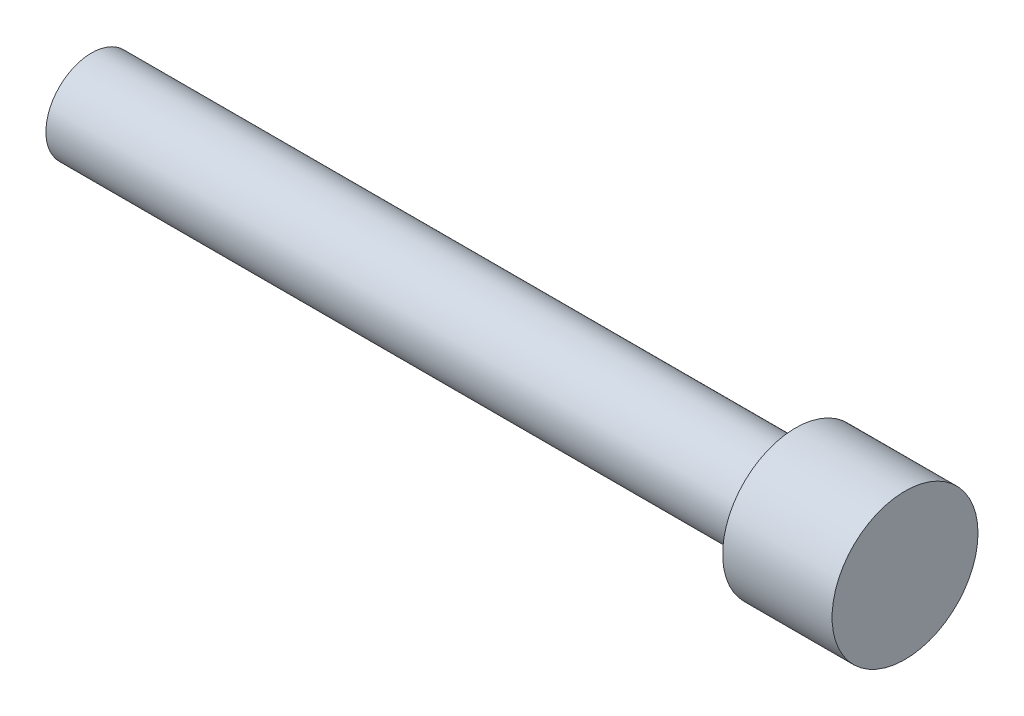
ISO-10303-21;
HEADER;
FILE_DESCRIPTION(('STEP AP214'),'2;1');
FILE_NAME('part.step','',(''),(''),'','','');
FILE_SCHEMA(('AUTOMOTIVE_DESIGN { 1 0 10303 214 1 1 1 1 }'));
ENDSEC;
DATA;
#1=APPLICATION_CONTEXT('core data for automotive mechanical design processes');
#2=APPLICATION_PROTOCOL_DEFINITION('international standard','automotive_design',2000,#1);
#3=PRODUCT_CONTEXT('',#1,'mechanical');
#4=PRODUCT('Part','Part','',(#3));
#5=PRODUCT_RELATED_PRODUCT_CATEGORY('part','',(#4));
#6=PRODUCT_DEFINITION_FORMATION('','',#4);
#7=PRODUCT_DEFINITION_CONTEXT('part definition',#1,'design');
#8=PRODUCT_DEFINITION('design','',#6,#7);
#9=PRODUCT_DEFINITION_SHAPE('','',#8);
#10=(LENGTH_UNIT() NAMED_UNIT(*) SI_UNIT(.MILLI.,.METRE.));
#11=(NAMED_UNIT(*) PLANE_ANGLE_UNIT() SI_UNIT($,.RADIAN.));
#12=(NAMED_UNIT(*) SI_UNIT($,.STERADIAN.) SOLID_ANGLE_UNIT());
#13=UNCERTAINTY_MEASURE_WITH_UNIT(LENGTH_MEASURE(1.E-05),#10,'distance_accuracy_value','');
#14=(GEOMETRIC_REPRESENTATION_CONTEXT(3) GLOBAL_UNCERTAINTY_ASSIGNED_CONTEXT((#13)) GLOBAL_UNIT_ASSIGNED_CONTEXT((#10,
#11,#12)) REPRESENTATION_CONTEXT('',''));
#15=CARTESIAN_POINT('',(0.,0.,0.));
#16=DIRECTION('',(0.,0.,1.));
#17=DIRECTION('',(1.,0.,0.));
#18=AXIS2_PLACEMENT_3D('',#15,#16,#17);
#19=CARTESIAN_POINT('',(9.65,0.,0.));
#20=DIRECTION('',(-1.,0.,0.));
#21=DIRECTION('',(0.,0.,1.));
#22=AXIS2_PLACEMENT_3D('',#19,#20,#21);
#23=CYLINDRICAL_SURFACE('',#22,1.25);
#24=CARTESIAN_POINT('',(9.65,0.,0.));
#25=DIRECTION('',(1.,0.,0.));
#26=DIRECTION('',(0.,0.,-1.));
#27=AXIS2_PLACEMENT_3D('',#24,#25,#26);
#28=CIRCLE('',#27,1.25);
#29=CARTESIAN_POINT('',(9.65,0.,-1.25));
#30=VERTEX_POINT('',#29);
#31=EDGE_CURVE('E10',#30,#30,#28,.T.);
#32=ORIENTED_EDGE('',*,*,#31,.F.);
#33=EDGE_LOOP('',(#32));
#34=FACE_BOUND('',#33,.T.);
#35=CARTESIAN_POINT('',(-9.65,0.,0.));
#36=DIRECTION('',(1.,0.,0.));
#37=DIRECTION('',(0.,0.,-1.));
#38=AXIS2_PLACEMENT_3D('',#35,#36,#37);
#39=CIRCLE('',#38,1.25);
#40=CARTESIAN_POINT('',(-9.65,0.,-1.25));
#41=VERTEX_POINT('',#40);
#42=EDGE_CURVE('E34',#41,#41,#39,.T.);
#43=ORIENTED_EDGE('',*,*,#42,.T.);
#44=EDGE_LOOP('',(#43));
#45=FACE_BOUND('',#44,.T.);
#46=ADVANCED_FACE('F31',(#34,#45),#23,.T.);
#47=CARTESIAN_POINT('',(-9.65,0.,0.));
#48=DIRECTION('',(1.,0.,0.));
#49=DIRECTION('',(0.,0.,-1.));
#50=AXIS2_PLACEMENT_3D('',#47,#48,#49);
#51=PLANE('',#50);
#52=ORIENTED_EDGE('',*,*,#42,.F.);
#53=EDGE_LOOP('',(#52));
#54=FACE_BOUND('',#53,.T.);
#55=ADVANCED_FACE('F54',(#54),#51,.F.);
#56=CARTESIAN_POINT('',(12.65,0.,0.));
#57=DIRECTION('',(-1.,0.,0.));
#58=DIRECTION('',(0.,0.,1.));
#59=AXIS2_PLACEMENT_3D('',#56,#57,#58);
#60=CYLINDRICAL_SURFACE('',#59,2.);
#61=CARTESIAN_POINT('',(12.65,0.,0.));
#62=DIRECTION('',(1.,0.,0.));
#63=DIRECTION('',(0.,0.,-1.));
#64=AXIS2_PLACEMENT_3D('',#61,#62,#63);
#65=CIRCLE('',#64,2.);
#66=CARTESIAN_POINT('',(12.65,0.,-2.));
#67=VERTEX_POINT('',#66);
#68=EDGE_CURVE('E41',#67,#67,#65,.T.);
#69=ORIENTED_EDGE('',*,*,#68,.F.);
#70=EDGE_LOOP('',(#69));
#71=FACE_BOUND('',#70,.T.);
#72=CARTESIAN_POINT('',(9.65,0.,0.));
#73=DIRECTION('',(1.,0.,0.));
#74=DIRECTION('',(0.,0.,-1.));
#75=AXIS2_PLACEMENT_3D('',#72,#73,#74);
#76=CIRCLE('',#75,2.);
#77=CARTESIAN_POINT('',(9.65,0.,-2.));
#78=VERTEX_POINT('',#77);
#79=EDGE_CURVE('E43',#78,#78,#76,.T.);
#80=ORIENTED_EDGE('',*,*,#79,.T.);
#81=EDGE_LOOP('',(#80));
#82=FACE_BOUND('',#81,.T.);
#83=ADVANCED_FACE('F51',(#71,#82),#60,.T.);
#84=CARTESIAN_POINT('',(12.65,0.,0.));
#85=DIRECTION('',(1.,0.,0.));
#86=DIRECTION('',(0.,0.,-1.));
#87=AXIS2_PLACEMENT_3D('',#84,#85,#86);
#88=PLANE('',#87);
#89=ORIENTED_EDGE('',*,*,#68,.T.);
#90=EDGE_LOOP('',(#89));
#91=FACE_BOUND('',#90,.T.);
#92=ADVANCED_FACE('F49',(#91),#88,.T.);
#93=CARTESIAN_POINT('',(9.65,0.,0.));
#94=DIRECTION('',(1.,0.,0.));
#95=DIRECTION('',(0.,0.,-1.));
#96=AXIS2_PLACEMENT_3D('',#93,#94,#95);
#97=PLANE('',#96);
#98=ORIENTED_EDGE('',*,*,#31,.T.);
#99=EDGE_LOOP('',(#98));
#100=FACE_BOUND('',#99,.T.);
#101=ORIENTED_EDGE('',*,*,#79,.F.);
#102=EDGE_LOOP('',(#101));
#103=FACE_BOUND('',#102,.T.);
#104=ADVANCED_FACE('F58',(#100,#103),#97,.F.);
#105=CLOSED_SHELL('',(#46,#55,#83,#92,#104));
#106=MANIFOLD_SOLID_BREP('B2',#105);
#107=ADVANCED_BREP_SHAPE_REPRESENTATION('',(#18,#106),#14);
#108=SHAPE_DEFINITION_REPRESENTATION(#9,#107);
ENDSEC;
END-ISO-10303-21;
